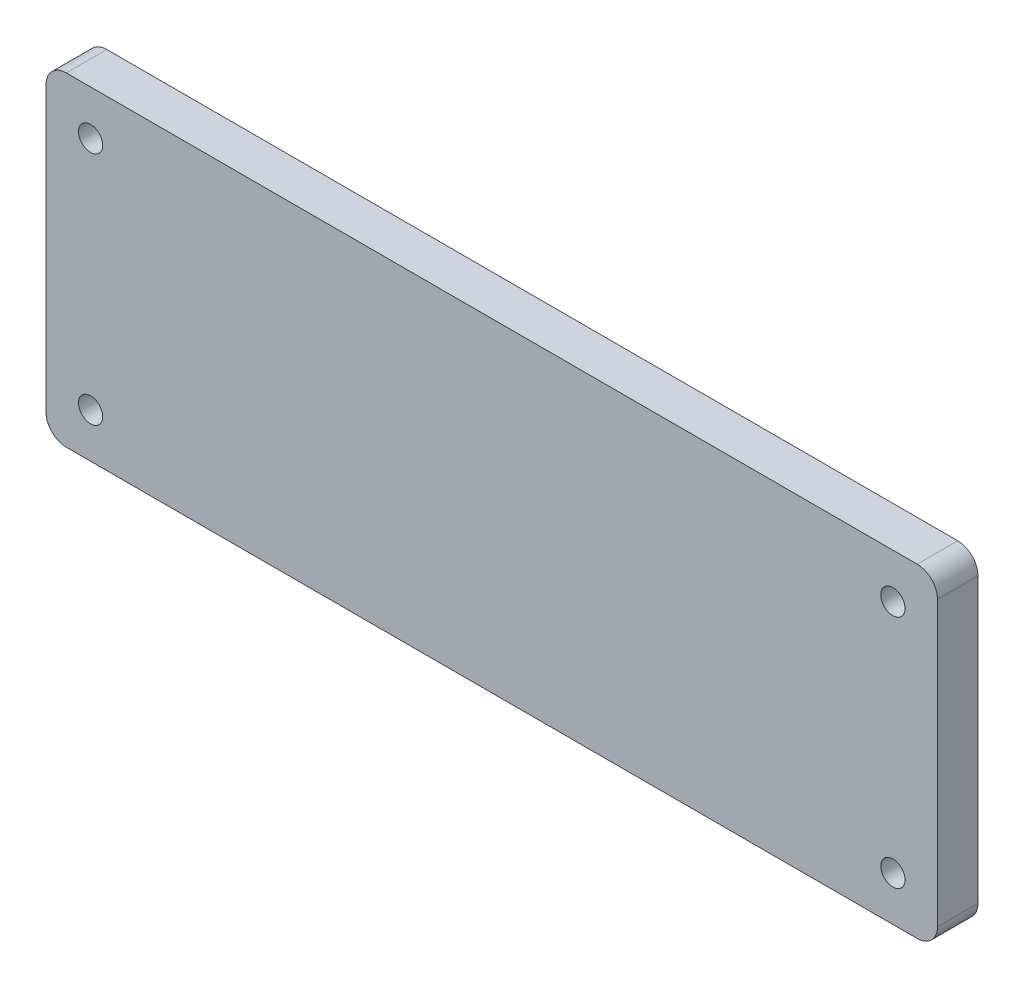
ISO-10303-21;
HEADER;
FILE_DESCRIPTION(('STEP AP214'),'2;1');
FILE_NAME('part.step','',(''),(''),'','','');
FILE_SCHEMA(('AUTOMOTIVE_DESIGN { 1 0 10303 214 1 1 1 1 }'));
ENDSEC;
DATA;
#1=APPLICATION_CONTEXT('core data for automotive mechanical design processes');
#2=APPLICATION_PROTOCOL_DEFINITION('international standard','automotive_design',2000,#1);
#3=PRODUCT_CONTEXT('',#1,'mechanical');
#4=PRODUCT('Part','Part','',(#3));
#5=PRODUCT_RELATED_PRODUCT_CATEGORY('part','',(#4));
#6=PRODUCT_DEFINITION_FORMATION('','',#4);
#7=PRODUCT_DEFINITION_CONTEXT('part definition',#1,'design');
#8=PRODUCT_DEFINITION('design','',#6,#7);
#9=PRODUCT_DEFINITION_SHAPE('','',#8);
#10=(LENGTH_UNIT() NAMED_UNIT(*) SI_UNIT(.MILLI.,.METRE.));
#11=(NAMED_UNIT(*) PLANE_ANGLE_UNIT() SI_UNIT($,.RADIAN.));
#12=(NAMED_UNIT(*) SI_UNIT($,.STERADIAN.) SOLID_ANGLE_UNIT());
#13=UNCERTAINTY_MEASURE_WITH_UNIT(LENGTH_MEASURE(1.E-05),#10,'distance_accuracy_value','');
#14=(GEOMETRIC_REPRESENTATION_CONTEXT(3) GLOBAL_UNCERTAINTY_ASSIGNED_CONTEXT((#13)) GLOBAL_UNIT_ASSIGNED_CONTEXT((#10,
#11,#12)) REPRESENTATION_CONTEXT('',''));
#15=CARTESIAN_POINT('',(0.,0.,0.));
#16=DIRECTION('',(0.,0.,1.));
#17=DIRECTION('',(1.,0.,0.));
#18=AXIS2_PLACEMENT_3D('',#15,#16,#17);
#19=CARTESIAN_POINT('',(99.,-29.,9.9));
#20=DIRECTION('',(0.,0.,-1.));
#21=DIRECTION('',(-1.,0.,0.));
#22=AXIS2_PLACEMENT_3D('',#19,#20,#21);
#23=CYLINDRICAL_SURFACE('',#22,3.);
#24=CARTESIAN_POINT('',(99.,-29.,10.));
#25=DIRECTION('',(0.,0.,1.));
#26=DIRECTION('',(-1.,0.,0.));
#27=AXIS2_PLACEMENT_3D('',#24,#25,#26);
#28=CIRCLE('',#27,3.);
#29=CARTESIAN_POINT('',(96.,-29.,10.));
#30=VERTEX_POINT('',#29);
#31=EDGE_CURVE('E138',#30,#30,#28,.T.);
#32=ORIENTED_EDGE('',*,*,#31,.T.);
#33=EDGE_LOOP('',(#32));
#34=FACE_BOUND('',#33,.T.);
#35=CARTESIAN_POINT('',(99.,-29.,0.));
#36=DIRECTION('',(0.,0.,-1.));
#37=DIRECTION('',(-1.,0.,0.));
#38=AXIS2_PLACEMENT_3D('',#35,#36,#37);
#39=CIRCLE('',#38,3.);
#40=CARTESIAN_POINT('',(96.,-29.,0.));
#41=VERTEX_POINT('',#40);
#42=EDGE_CURVE('E129',#41,#41,#39,.T.);
#43=ORIENTED_EDGE('',*,*,#42,.T.);
#44=EDGE_LOOP('',(#43));
#45=FACE_BOUND('',#44,.T.);
#46=ADVANCED_FACE('F15',(#34,#45),#23,.F.);
#47=CARTESIAN_POINT('',(99.,29.,9.9));
#48=DIRECTION('',(0.,0.,-1.));
#49=DIRECTION('',(-1.,0.,0.));
#50=AXIS2_PLACEMENT_3D('',#47,#48,#49);
#51=CYLINDRICAL_SURFACE('',#50,3.);
#52=CARTESIAN_POINT('',(99.,29.,10.));
#53=DIRECTION('',(0.,0.,1.));
#54=DIRECTION('',(-1.,0.,0.));
#55=AXIS2_PLACEMENT_3D('',#52,#53,#54);
#56=CIRCLE('',#55,3.);
#57=CARTESIAN_POINT('',(96.,29.,10.));
#58=VERTEX_POINT('',#57);
#59=EDGE_CURVE('E90',#58,#58,#56,.T.);
#60=ORIENTED_EDGE('',*,*,#59,.T.);
#61=EDGE_LOOP('',(#60));
#62=FACE_BOUND('',#61,.T.);
#63=CARTESIAN_POINT('',(99.,29.,0.));
#64=DIRECTION('',(0.,0.,-1.));
#65=DIRECTION('',(-1.,0.,0.));
#66=AXIS2_PLACEMENT_3D('',#63,#64,#65);
#67=CIRCLE('',#66,3.);
#68=CARTESIAN_POINT('',(96.,29.,0.));
#69=VERTEX_POINT('',#68);
#70=EDGE_CURVE('E107',#69,#69,#67,.T.);
#71=ORIENTED_EDGE('',*,*,#70,.T.);
#72=EDGE_LOOP('',(#71));
#73=FACE_BOUND('',#72,.T.);
#74=ADVANCED_FACE('F201',(#62,#73),#51,.F.);
#75=CARTESIAN_POINT('',(-99.,29.,9.9));
#76=DIRECTION('',(0.,0.,-1.));
#77=DIRECTION('',(-1.,0.,0.));
#78=AXIS2_PLACEMENT_3D('',#75,#76,#77);
#79=CYLINDRICAL_SURFACE('',#78,3.);
#80=CARTESIAN_POINT('',(-99.,29.,10.));
#81=DIRECTION('',(0.,0.,1.));
#82=DIRECTION('',(-1.,0.,0.));
#83=AXIS2_PLACEMENT_3D('',#80,#81,#82);
#84=CIRCLE('',#83,3.);
#85=CARTESIAN_POINT('',(-102.,29.,10.));
#86=VERTEX_POINT('',#85);
#87=EDGE_CURVE('E144',#86,#86,#84,.T.);
#88=ORIENTED_EDGE('',*,*,#87,.T.);
#89=EDGE_LOOP('',(#88));
#90=FACE_BOUND('',#89,.T.);
#91=CARTESIAN_POINT('',(-99.,29.,0.));
#92=DIRECTION('',(0.,0.,-1.));
#93=DIRECTION('',(-1.,0.,0.));
#94=AXIS2_PLACEMENT_3D('',#91,#92,#93);
#95=CIRCLE('',#94,3.);
#96=CARTESIAN_POINT('',(-102.,29.,0.));
#97=VERTEX_POINT('',#96);
#98=EDGE_CURVE('E109',#97,#97,#95,.T.);
#99=ORIENTED_EDGE('',*,*,#98,.T.);
#100=EDGE_LOOP('',(#99));
#101=FACE_BOUND('',#100,.T.);
#102=ADVANCED_FACE('F207',(#90,#101),#79,.F.);
#103=CARTESIAN_POINT('',(-99.,-29.,9.9));
#104=DIRECTION('',(0.,0.,-1.));
#105=DIRECTION('',(-1.,0.,0.));
#106=AXIS2_PLACEMENT_3D('',#103,#104,#105);
#107=CYLINDRICAL_SURFACE('',#106,3.);
#108=CARTESIAN_POINT('',(-99.,-29.,10.));
#109=DIRECTION('',(0.,0.,1.));
#110=DIRECTION('',(-1.,0.,0.));
#111=AXIS2_PLACEMENT_3D('',#108,#109,#110);
#112=CIRCLE('',#111,3.);
#113=CARTESIAN_POINT('',(-102.,-29.,10.));
#114=VERTEX_POINT('',#113);
#115=EDGE_CURVE('E140',#114,#114,#112,.T.);
#116=ORIENTED_EDGE('',*,*,#115,.T.);
#117=EDGE_LOOP('',(#116));
#118=FACE_BOUND('',#117,.T.);
#119=CARTESIAN_POINT('',(-99.,-29.,0.));
#120=DIRECTION('',(0.,0.,-1.));
#121=DIRECTION('',(-1.,0.,0.));
#122=AXIS2_PLACEMENT_3D('',#119,#120,#121);
#123=CIRCLE('',#122,3.);
#124=CARTESIAN_POINT('',(-102.,-29.,0.));
#125=VERTEX_POINT('',#124);
#126=EDGE_CURVE('E131',#125,#125,#123,.T.);
#127=ORIENTED_EDGE('',*,*,#126,.T.);
#128=EDGE_LOOP('',(#127));
#129=FACE_BOUND('',#128,.T.);
#130=ADVANCED_FACE('F213',(#118,#129),#107,.F.);
#131=CARTESIAN_POINT('',(-105.,-35.,5.));
#132=DIRECTION('',(0.,0.,1.));
#133=DIRECTION('',(1.,0.,0.));
#134=AXIS2_PLACEMENT_3D('',#131,#132,#133);
#135=CYLINDRICAL_SURFACE('',#134,5.);
#136=DIRECTION('',(0.,0.,1.));
#137=VECTOR('',#136,1.);
#138=CARTESIAN_POINT('',(-105.,-40.,5.));
#139=LINE('',#138,#137);
#140=CARTESIAN_POINT('',(-105.,-40.,0.));
#141=VERTEX_POINT('',#140);
#142=CARTESIAN_POINT('',(-105.,-40.,10.));
#143=VERTEX_POINT('',#142);
#144=EDGE_CURVE('E25',#141,#143,#139,.T.);
#145=ORIENTED_EDGE('',*,*,#144,.T.);
#146=CARTESIAN_POINT('',(-105.,-35.,10.));
#147=DIRECTION('',(0.,0.,-1.));
#148=DIRECTION('',(1.,0.,0.));
#149=AXIS2_PLACEMENT_3D('',#146,#147,#148);
#150=CIRCLE('',#149,5.);
#151=CARTESIAN_POINT('',(-110.,-35.,10.));
#152=VERTEX_POINT('',#151);
#153=EDGE_CURVE('E116',#143,#152,#150,.T.);
#154=ORIENTED_EDGE('',*,*,#153,.T.);
#155=DIRECTION('',(0.,0.,1.));
#156=VECTOR('',#155,1.);
#157=CARTESIAN_POINT('',(-110.,-35.,5.));
#158=LINE('',#157,#156);
#159=CARTESIAN_POINT('',(-110.,-35.,0.));
#160=VERTEX_POINT('',#159);
#161=EDGE_CURVE('E9',#160,#152,#158,.T.);
#162=ORIENTED_EDGE('',*,*,#161,.F.);
#163=CARTESIAN_POINT('',(-105.,-35.,0.));
#164=DIRECTION('',(0.,0.,1.));
#165=DIRECTION('',(1.,0.,0.));
#166=AXIS2_PLACEMENT_3D('',#163,#164,#165);
#167=CIRCLE('',#166,5.);
#168=EDGE_CURVE('E34',#160,#141,#167,.T.);
#169=ORIENTED_EDGE('',*,*,#168,.T.);
#170=EDGE_LOOP('',(#145,#154,#162,#169));
#171=FACE_BOUND('',#170,.T.);
#172=ADVANCED_FACE('F180',(#171),#135,.T.);
#173=CARTESIAN_POINT('',(110.,-40.,0.));
#174=DIRECTION('',(0.,1.,0.));
#175=DIRECTION('',(0.,0.,1.));
#176=AXIS2_PLACEMENT_3D('',#173,#174,#175);
#177=PLANE('',#176);
#178=DIRECTION('',(1.,0.,0.));
#179=VECTOR('',#178,1.);
#180=CARTESIAN_POINT('',(0.,-40.,0.));
#181=LINE('',#180,#179);
#182=CARTESIAN_POINT('',(105.,-40.,0.));
#183=VERTEX_POINT('',#182);
#184=EDGE_CURVE('E153',#141,#183,#181,.T.);
#185=ORIENTED_EDGE('',*,*,#184,.T.);
#186=DIRECTION('',(0.,0.,1.));
#187=VECTOR('',#186,1.);
#188=CARTESIAN_POINT('',(105.,-40.,5.));
#189=LINE('',#188,#187);
#190=CARTESIAN_POINT('',(105.,-40.,10.));
#191=VERTEX_POINT('',#190);
#192=EDGE_CURVE('E160',#183,#191,#189,.T.);
#193=ORIENTED_EDGE('',*,*,#192,.T.);
#194=DIRECTION('',(1.,0.,0.));
#195=VECTOR('',#194,1.);
#196=CARTESIAN_POINT('',(0.,-40.,10.));
#197=LINE('',#196,#195);
#198=EDGE_CURVE('E152',#143,#191,#197,.T.);
#199=ORIENTED_EDGE('',*,*,#198,.F.);
#200=ORIENTED_EDGE('',*,*,#144,.F.);
#201=EDGE_LOOP('',(#185,#193,#199,#200));
#202=FACE_BOUND('',#201,.T.);
#203=ADVANCED_FACE('F182',(#202),#177,.F.);
#204=CARTESIAN_POINT('',(105.,-35.,5.));
#205=DIRECTION('',(0.,0.,1.));
#206=DIRECTION('',(1.,0.,0.));
#207=AXIS2_PLACEMENT_3D('',#204,#205,#206);
#208=CYLINDRICAL_SURFACE('',#207,5.);
#209=DIRECTION('',(0.,0.,1.));
#210=VECTOR('',#209,1.);
#211=CARTESIAN_POINT('',(110.,-35.,5.));
#212=LINE('',#211,#210);
#213=CARTESIAN_POINT('',(110.,-35.,0.));
#214=VERTEX_POINT('',#213);
#215=CARTESIAN_POINT('',(110.,-35.,10.));
#216=VERTEX_POINT('',#215);
#217=EDGE_CURVE('E162',#214,#216,#212,.T.);
#218=ORIENTED_EDGE('',*,*,#217,.T.);
#219=CARTESIAN_POINT('',(105.,-35.,10.));
#220=DIRECTION('',(0.,0.,-1.));
#221=DIRECTION('',(1.,0.,0.));
#222=AXIS2_PLACEMENT_3D('',#219,#220,#221);
#223=CIRCLE('',#222,5.);
#224=EDGE_CURVE('E111',#216,#191,#223,.T.);
#225=ORIENTED_EDGE('',*,*,#224,.T.);
#226=ORIENTED_EDGE('',*,*,#192,.F.);
#227=CARTESIAN_POINT('',(105.,-35.,0.));
#228=DIRECTION('',(0.,0.,1.));
#229=DIRECTION('',(1.,0.,0.));
#230=AXIS2_PLACEMENT_3D('',#227,#228,#229);
#231=CIRCLE('',#230,5.);
#232=EDGE_CURVE('E157',#183,#214,#231,.T.);
#233=ORIENTED_EDGE('',*,*,#232,.T.);
#234=EDGE_LOOP('',(#218,#225,#226,#233));
#235=FACE_BOUND('',#234,.T.);
#236=ADVANCED_FACE('F186',(#235),#208,.T.);
#237=CARTESIAN_POINT('',(110.,40.,0.));
#238=DIRECTION('',(-1.,0.,0.));
#239=DIRECTION('',(0.,0.,1.));
#240=AXIS2_PLACEMENT_3D('',#237,#238,#239);
#241=PLANE('',#240);
#242=DIRECTION('',(0.,1.,0.));
#243=VECTOR('',#242,1.);
#244=CARTESIAN_POINT('',(110.,0.,0.));
#245=LINE('',#244,#243);
#246=CARTESIAN_POINT('',(110.,35.,0.));
#247=VERTEX_POINT('',#246);
#248=EDGE_CURVE('E166',#214,#247,#245,.T.);
#249=ORIENTED_EDGE('',*,*,#248,.T.);
#250=DIRECTION('',(0.,0.,1.));
#251=VECTOR('',#250,1.);
#252=CARTESIAN_POINT('',(110.,35.,5.));
#253=LINE('',#252,#251);
#254=CARTESIAN_POINT('',(110.,35.,10.));
#255=VERTEX_POINT('',#254);
#256=EDGE_CURVE('E124',#247,#255,#253,.T.);
#257=ORIENTED_EDGE('',*,*,#256,.T.);
#258=DIRECTION('',(0.,1.,0.));
#259=VECTOR('',#258,1.);
#260=CARTESIAN_POINT('',(110.,0.,10.));
#261=LINE('',#260,#259);
#262=EDGE_CURVE('E165',#216,#255,#261,.T.);
#263=ORIENTED_EDGE('',*,*,#262,.F.);
#264=ORIENTED_EDGE('',*,*,#217,.F.);
#265=EDGE_LOOP('',(#249,#257,#263,#264));
#266=FACE_BOUND('',#265,.T.);
#267=ADVANCED_FACE('F189',(#266),#241,.F.);
#268=CARTESIAN_POINT('',(105.,35.,5.));
#269=DIRECTION('',(0.,0.,1.));
#270=DIRECTION('',(1.,0.,0.));
#271=AXIS2_PLACEMENT_3D('',#268,#269,#270);
#272=CYLINDRICAL_SURFACE('',#271,5.);
#273=DIRECTION('',(0.,0.,1.));
#274=VECTOR('',#273,1.);
#275=CARTESIAN_POINT('',(105.,40.,5.));
#276=LINE('',#275,#274);
#277=CARTESIAN_POINT('',(105.,40.,0.));
#278=VERTEX_POINT('',#277);
#279=CARTESIAN_POINT('',(105.,40.,10.));
#280=VERTEX_POINT('',#279);
#281=EDGE_CURVE('E101',#278,#280,#276,.T.);
#282=ORIENTED_EDGE('',*,*,#281,.T.);
#283=CARTESIAN_POINT('',(105.,35.,10.));
#284=DIRECTION('',(0.,0.,-1.));
#285=DIRECTION('',(1.,0.,0.));
#286=AXIS2_PLACEMENT_3D('',#283,#284,#285);
#287=CIRCLE('',#286,5.);
#288=EDGE_CURVE('E99',#280,#255,#287,.T.);
#289=ORIENTED_EDGE('',*,*,#288,.T.);
#290=ORIENTED_EDGE('',*,*,#256,.F.);
#291=CARTESIAN_POINT('',(105.,35.,0.));
#292=DIRECTION('',(0.,0.,1.));
#293=DIRECTION('',(1.,0.,0.));
#294=AXIS2_PLACEMENT_3D('',#291,#292,#293);
#295=CIRCLE('',#294,5.);
#296=EDGE_CURVE('E120',#247,#278,#295,.T.);
#297=ORIENTED_EDGE('',*,*,#296,.T.);
#298=EDGE_LOOP('',(#282,#289,#290,#297));
#299=FACE_BOUND('',#298,.T.);
#300=ADVANCED_FACE('F170',(#299),#272,.T.);
#301=CARTESIAN_POINT('',(-110.,-40.,0.));
#302=DIRECTION('',(1.,0.,0.));
#303=DIRECTION('',(0.,0.,-1.));
#304=AXIS2_PLACEMENT_3D('',#301,#302,#303);
#305=PLANE('',#304);
#306=DIRECTION('',(0.,-1.,0.));
#307=VECTOR('',#306,1.);
#308=CARTESIAN_POINT('',(-110.,0.,10.));
#309=LINE('',#308,#307);
#310=CARTESIAN_POINT('',(-110.,35.,10.));
#311=VERTEX_POINT('',#310);
#312=EDGE_CURVE('E122',#311,#152,#309,.T.);
#313=ORIENTED_EDGE('',*,*,#312,.F.);
#314=DIRECTION('',(0.,0.,1.));
#315=VECTOR('',#314,1.);
#316=CARTESIAN_POINT('',(-110.,35.,5.));
#317=LINE('',#316,#315);
#318=CARTESIAN_POINT('',(-110.,35.,0.));
#319=VERTEX_POINT('',#318);
#320=EDGE_CURVE('E105',#319,#311,#317,.T.);
#321=ORIENTED_EDGE('',*,*,#320,.F.);
#322=DIRECTION('',(0.,-1.,0.));
#323=VECTOR('',#322,1.);
#324=CARTESIAN_POINT('',(-110.,0.,0.));
#325=LINE('',#324,#323);
#326=EDGE_CURVE('E102',#319,#160,#325,.T.);
#327=ORIENTED_EDGE('',*,*,#326,.T.);
#328=ORIENTED_EDGE('',*,*,#161,.T.);
#329=EDGE_LOOP('',(#313,#321,#327,#328));
#330=FACE_BOUND('',#329,.T.);
#331=ADVANCED_FACE('F178',(#330),#305,.F.);
#332=CARTESIAN_POINT('',(-110.,40.,0.));
#333=DIRECTION('',(0.,-1.,0.));
#334=DIRECTION('',(0.,0.,-1.));
#335=AXIS2_PLACEMENT_3D('',#332,#333,#334);
#336=PLANE('',#335);
#337=DIRECTION('',(-1.,0.,0.));
#338=VECTOR('',#337,1.);
#339=CARTESIAN_POINT('',(0.,40.,0.));
#340=LINE('',#339,#338);
#341=CARTESIAN_POINT('',(-105.,40.,0.));
#342=VERTEX_POINT('',#341);
#343=EDGE_CURVE('E88',#278,#342,#340,.T.);
#344=ORIENTED_EDGE('',*,*,#343,.T.);
#345=DIRECTION('',(0.,0.,1.));
#346=VECTOR('',#345,1.);
#347=CARTESIAN_POINT('',(-105.,40.,5.));
#348=LINE('',#347,#346);
#349=CARTESIAN_POINT('',(-105.,40.,10.));
#350=VERTEX_POINT('',#349);
#351=EDGE_CURVE('E79',#342,#350,#348,.T.);
#352=ORIENTED_EDGE('',*,*,#351,.T.);
#353=DIRECTION('',(-1.,0.,0.));
#354=VECTOR('',#353,1.);
#355=CARTESIAN_POINT('',(0.,40.,10.));
#356=LINE('',#355,#354);
#357=EDGE_CURVE('E86',#280,#350,#356,.T.);
#358=ORIENTED_EDGE('',*,*,#357,.F.);
#359=ORIENTED_EDGE('',*,*,#281,.F.);
#360=EDGE_LOOP('',(#344,#352,#358,#359));
#361=FACE_BOUND('',#360,.T.);
#362=ADVANCED_FACE('F84',(#361),#336,.F.);
#363=CARTESIAN_POINT('',(0.,0.,0.));
#364=DIRECTION('',(0.,0.,1.));
#365=DIRECTION('',(1.,0.,0.));
#366=AXIS2_PLACEMENT_3D('',#363,#364,#365);
#367=PLANE('',#366);
#368=ORIENTED_EDGE('',*,*,#326,.F.);
#369=CARTESIAN_POINT('',(-105.,35.,0.));
#370=DIRECTION('',(0.,0.,1.));
#371=DIRECTION('',(1.,0.,0.));
#372=AXIS2_PLACEMENT_3D('',#369,#370,#371);
#373=CIRCLE('',#372,5.);
#374=EDGE_CURVE('E128',#342,#319,#373,.T.);
#375=ORIENTED_EDGE('',*,*,#374,.F.);
#376=ORIENTED_EDGE('',*,*,#343,.F.);
#377=ORIENTED_EDGE('',*,*,#296,.F.);
#378=ORIENTED_EDGE('',*,*,#248,.F.);
#379=ORIENTED_EDGE('',*,*,#232,.F.);
#380=ORIENTED_EDGE('',*,*,#184,.F.);
#381=ORIENTED_EDGE('',*,*,#168,.F.);
#382=EDGE_LOOP('',(#368,#375,#376,#377,#378,#379,#380,#381));
#383=FACE_BOUND('',#382,.T.);
#384=ORIENTED_EDGE('',*,*,#42,.F.);
#385=EDGE_LOOP('',(#384));
#386=FACE_BOUND('',#385,.T.);
#387=ORIENTED_EDGE('',*,*,#126,.F.);
#388=EDGE_LOOP('',(#387));
#389=FACE_BOUND('',#388,.T.);
#390=ORIENTED_EDGE('',*,*,#98,.F.);
#391=EDGE_LOOP('',(#390));
#392=FACE_BOUND('',#391,.T.);
#393=ORIENTED_EDGE('',*,*,#70,.F.);
#394=EDGE_LOOP('',(#393));
#395=FACE_BOUND('',#394,.T.);
#396=ADVANCED_FACE('F173',(#383,#386,#389,#392,#395),#367,.F.);
#397=CARTESIAN_POINT('',(0.,0.,10.));
#398=DIRECTION('',(0.,0.,1.));
#399=DIRECTION('',(1.,0.,0.));
#400=AXIS2_PLACEMENT_3D('',#397,#398,#399);
#401=PLANE('',#400);
#402=CARTESIAN_POINT('',(-105.,35.,10.));
#403=DIRECTION('',(0.,0.,-1.));
#404=DIRECTION('',(1.,0.,0.));
#405=AXIS2_PLACEMENT_3D('',#402,#403,#404);
#406=CIRCLE('',#405,5.);
#407=EDGE_CURVE('E19',#311,#350,#406,.T.);
#408=ORIENTED_EDGE('',*,*,#407,.F.);
#409=ORIENTED_EDGE('',*,*,#312,.T.);
#410=ORIENTED_EDGE('',*,*,#153,.F.);
#411=ORIENTED_EDGE('',*,*,#198,.T.);
#412=ORIENTED_EDGE('',*,*,#224,.F.);
#413=ORIENTED_EDGE('',*,*,#262,.T.);
#414=ORIENTED_EDGE('',*,*,#288,.F.);
#415=ORIENTED_EDGE('',*,*,#357,.T.);
#416=EDGE_LOOP('',(#408,#409,#410,#411,#412,#413,#414,#415));
#417=FACE_BOUND('',#416,.T.);
#418=ORIENTED_EDGE('',*,*,#31,.F.);
#419=EDGE_LOOP('',(#418));
#420=FACE_BOUND('',#419,.T.);
#421=ORIENTED_EDGE('',*,*,#115,.F.);
#422=EDGE_LOOP('',(#421));
#423=FACE_BOUND('',#422,.T.);
#424=ORIENTED_EDGE('',*,*,#87,.F.);
#425=EDGE_LOOP('',(#424));
#426=FACE_BOUND('',#425,.T.);
#427=ORIENTED_EDGE('',*,*,#59,.F.);
#428=EDGE_LOOP('',(#427));
#429=FACE_BOUND('',#428,.T.);
#430=ADVANCED_FACE('F94',(#417,#420,#423,#426,#429),#401,.T.);
#431=CARTESIAN_POINT('',(-105.,35.,5.));
#432=DIRECTION('',(0.,0.,1.));
#433=DIRECTION('',(1.,0.,0.));
#434=AXIS2_PLACEMENT_3D('',#431,#432,#433);
#435=CYLINDRICAL_SURFACE('',#434,5.);
#436=ORIENTED_EDGE('',*,*,#320,.T.);
#437=ORIENTED_EDGE('',*,*,#407,.T.);
#438=ORIENTED_EDGE('',*,*,#351,.F.);
#439=ORIENTED_EDGE('',*,*,#374,.T.);
#440=EDGE_LOOP('',(#436,#437,#438,#439));
#441=FACE_BOUND('',#440,.T.);
#442=ADVANCED_FACE('F17',(#441),#435,.T.);
#443=CLOSED_SHELL('',(#46,#74,#102,#130,#172,#203,#236,#267,#300,#331,#362,#396,#430,#442));
#444=MANIFOLD_SOLID_BREP('B1',#443);
#445=ADVANCED_BREP_SHAPE_REPRESENTATION('',(#18,#444),#14);
#446=SHAPE_DEFINITION_REPRESENTATION(#9,#445);
ENDSEC;
END-ISO-10303-21;
